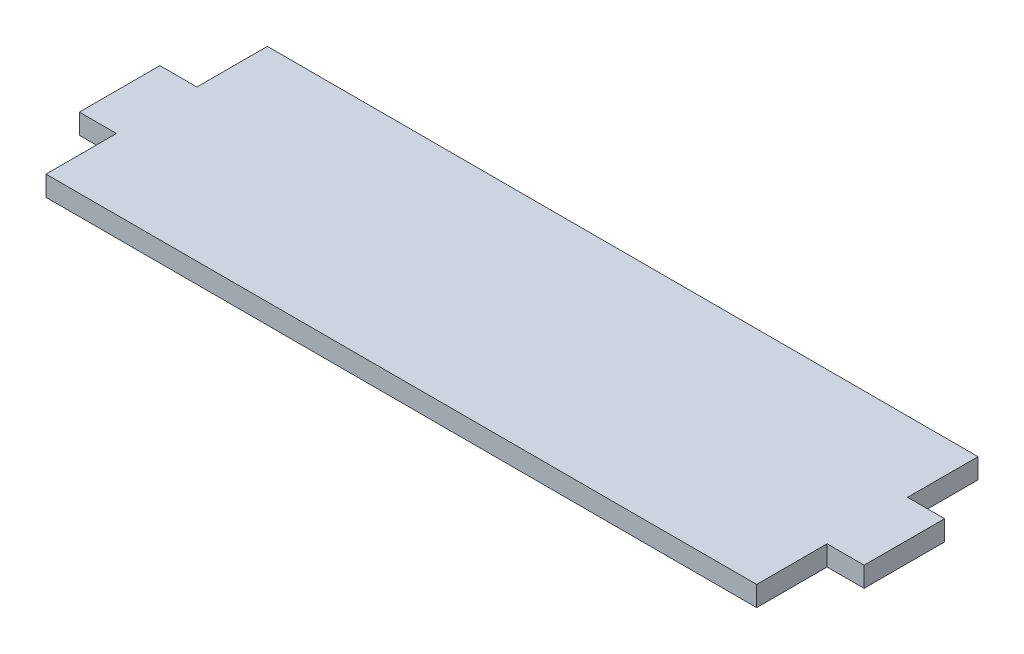
ISO-10303-21;
HEADER;
FILE_DESCRIPTION(('STEP AP214'),'2;1');
FILE_NAME('part.step','',(''),(''),'','','');
FILE_SCHEMA(('AUTOMOTIVE_DESIGN { 1 0 10303 214 1 1 1 1 }'));
ENDSEC;
DATA;
#1=APPLICATION_CONTEXT('core data for automotive mechanical design processes');
#2=APPLICATION_PROTOCOL_DEFINITION('international standard','automotive_design',2000,#1);
#3=PRODUCT_CONTEXT('',#1,'mechanical');
#4=PRODUCT('Part','Part','',(#3));
#5=PRODUCT_RELATED_PRODUCT_CATEGORY('part','',(#4));
#6=PRODUCT_DEFINITION_FORMATION('','',#4);
#7=PRODUCT_DEFINITION_CONTEXT('part definition',#1,'design');
#8=PRODUCT_DEFINITION('design','',#6,#7);
#9=PRODUCT_DEFINITION_SHAPE('','',#8);
#10=(LENGTH_UNIT() NAMED_UNIT(*) SI_UNIT(.MILLI.,.METRE.));
#11=(NAMED_UNIT(*) PLANE_ANGLE_UNIT() SI_UNIT($,.RADIAN.));
#12=(NAMED_UNIT(*) SI_UNIT($,.STERADIAN.) SOLID_ANGLE_UNIT());
#13=UNCERTAINTY_MEASURE_WITH_UNIT(LENGTH_MEASURE(1.E-05),#10,'distance_accuracy_value','');
#14=(GEOMETRIC_REPRESENTATION_CONTEXT(3) GLOBAL_UNCERTAINTY_ASSIGNED_CONTEXT((#13)) GLOBAL_UNIT_ASSIGNED_CONTEXT((#10,
#11,#12)) REPRESENTATION_CONTEXT('',''));
#15=CARTESIAN_POINT('',(0.,0.,0.));
#16=DIRECTION('',(0.,0.,1.));
#17=DIRECTION('',(1.,0.,0.));
#18=AXIS2_PLACEMENT_3D('',#15,#16,#17);
#19=CARTESIAN_POINT('',(-56.0705,3.175,-6.34999999999999));
#20=DIRECTION('',(1.,0.,0.));
#21=DIRECTION('',(0.,0.,-1.));
#22=AXIS2_PLACEMENT_3D('',#19,#20,#21);
#23=PLANE('',#22);
#24=DIRECTION('',(0.,0.,1.));
#25=VECTOR('',#24,1.);
#26=CARTESIAN_POINT('',(-56.0705,0.,-6.34999999999999));
#27=LINE('',#26,#25);
#28=CARTESIAN_POINT('',(-56.0705,0.,-17.4625));
#29=VERTEX_POINT('',#28);
#30=CARTESIAN_POINT('',(-56.0705,0.,-6.34999999999999));
#31=VERTEX_POINT('',#30);
#32=EDGE_CURVE('E155',#29,#31,#27,.T.);
#33=ORIENTED_EDGE('',*,*,#32,.T.);
#34=DIRECTION('',(0.,-1.,0.));
#35=VECTOR('',#34,1.);
#36=CARTESIAN_POINT('',(-56.0705,3.175,-6.34999999999999));
#37=LINE('',#36,#35);
#38=CARTESIAN_POINT('',(-56.0705,3.175,-6.34999999999999));
#39=VERTEX_POINT('',#38);
#40=EDGE_CURVE('E11',#39,#31,#37,.T.);
#41=ORIENTED_EDGE('',*,*,#40,.F.);
#42=DIRECTION('',(0.,0.,1.));
#43=VECTOR('',#42,1.);
#44=CARTESIAN_POINT('',(-56.0705,3.175,-6.34999999999999));
#45=LINE('',#44,#43);
#46=CARTESIAN_POINT('',(-56.0705,3.175,-17.4625));
#47=VERTEX_POINT('',#46);
#48=EDGE_CURVE('E177',#47,#39,#45,.T.);
#49=ORIENTED_EDGE('',*,*,#48,.F.);
#50=DIRECTION('',(0.,-1.,0.));
#51=VECTOR('',#50,1.);
#52=CARTESIAN_POINT('',(-56.0705,3.175,-17.4625));
#53=LINE('',#52,#51);
#54=EDGE_CURVE('E151',#47,#29,#53,.T.);
#55=ORIENTED_EDGE('',*,*,#54,.T.);
#56=EDGE_LOOP('',(#33,#41,#49,#55));
#57=FACE_BOUND('',#56,.T.);
#58=ADVANCED_FACE('F35',(#57),#23,.F.);
#59=CARTESIAN_POINT('',(-61.9125,3.175,-6.34999999999999));
#60=DIRECTION('',(0.,0.,1.));
#61=DIRECTION('',(1.,0.,0.));
#62=AXIS2_PLACEMENT_3D('',#59,#60,#61);
#63=PLANE('',#62);
#64=DIRECTION('',(-1.,0.,0.));
#65=VECTOR('',#64,1.);
#66=CARTESIAN_POINT('',(-61.9125,0.,-6.34999999999999));
#67=LINE('',#66,#65);
#68=CARTESIAN_POINT('',(-61.9125,0.,-6.34999999999999));
#69=VERTEX_POINT('',#68);
#70=EDGE_CURVE('E158',#31,#69,#67,.T.);
#71=ORIENTED_EDGE('',*,*,#70,.T.);
#72=DIRECTION('',(0.,-1.,0.));
#73=VECTOR('',#72,1.);
#74=CARTESIAN_POINT('',(-61.9125,3.175,-6.34999999999999));
#75=LINE('',#74,#73);
#76=CARTESIAN_POINT('',(-61.9125,3.175,-6.34999999999999));
#77=VERTEX_POINT('',#76);
#78=EDGE_CURVE('E43',#77,#69,#75,.T.);
#79=ORIENTED_EDGE('',*,*,#78,.F.);
#80=DIRECTION('',(-1.,0.,0.));
#81=VECTOR('',#80,1.);
#82=CARTESIAN_POINT('',(-61.9125,3.175,-6.34999999999999));
#83=LINE('',#82,#81);
#84=EDGE_CURVE('E106',#39,#77,#83,.T.);
#85=ORIENTED_EDGE('',*,*,#84,.F.);
#86=ORIENTED_EDGE('',*,*,#40,.T.);
#87=EDGE_LOOP('',(#71,#79,#85,#86));
#88=FACE_BOUND('',#87,.T.);
#89=ADVANCED_FACE('F255',(#88),#63,.F.);
#90=CARTESIAN_POINT('',(-61.9125,3.175,6.35000000000001));
#91=DIRECTION('',(1.,0.,0.));
#92=DIRECTION('',(0.,0.,-1.));
#93=AXIS2_PLACEMENT_3D('',#90,#91,#92);
#94=PLANE('',#93);
#95=DIRECTION('',(0.,0.,1.));
#96=VECTOR('',#95,1.);
#97=CARTESIAN_POINT('',(-61.9125,0.,6.35000000000001));
#98=LINE('',#97,#96);
#99=CARTESIAN_POINT('',(-61.9125,0.,6.35000000000001));
#100=VERTEX_POINT('',#99);
#101=EDGE_CURVE('E160',#69,#100,#98,.T.);
#102=ORIENTED_EDGE('',*,*,#101,.T.);
#103=DIRECTION('',(0.,-1.,0.));
#104=VECTOR('',#103,1.);
#105=CARTESIAN_POINT('',(-61.9125,3.175,6.35000000000001));
#106=LINE('',#105,#104);
#107=CARTESIAN_POINT('',(-61.9125,3.175,6.35000000000001));
#108=VERTEX_POINT('',#107);
#109=EDGE_CURVE('E196',#108,#100,#106,.T.);
#110=ORIENTED_EDGE('',*,*,#109,.F.);
#111=DIRECTION('',(0.,0.,1.));
#112=VECTOR('',#111,1.);
#113=CARTESIAN_POINT('',(-61.9125,3.175,6.35000000000001));
#114=LINE('',#113,#112);
#115=EDGE_CURVE('E204',#77,#108,#114,.T.);
#116=ORIENTED_EDGE('',*,*,#115,.F.);
#117=ORIENTED_EDGE('',*,*,#78,.T.);
#118=EDGE_LOOP('',(#102,#110,#116,#117));
#119=FACE_BOUND('',#118,.T.);
#120=ADVANCED_FACE('F202',(#119),#94,.F.);
#121=CARTESIAN_POINT('',(-61.9125,3.175,6.35000000000001));
#122=DIRECTION('',(0.,0.,-1.));
#123=DIRECTION('',(-1.,0.,0.));
#124=AXIS2_PLACEMENT_3D('',#121,#122,#123);
#125=PLANE('',#124);
#126=DIRECTION('',(1.,0.,0.));
#127=VECTOR('',#126,1.);
#128=CARTESIAN_POINT('',(-61.9125,0.,6.35000000000001));
#129=LINE('',#128,#127);
#130=CARTESIAN_POINT('',(-56.0705,0.,6.35000000000001));
#131=VERTEX_POINT('',#130);
#132=EDGE_CURVE('E162',#100,#131,#129,.T.);
#133=ORIENTED_EDGE('',*,*,#132,.T.);
#134=DIRECTION('',(0.,-1.,0.));
#135=VECTOR('',#134,1.);
#136=CARTESIAN_POINT('',(-56.0705,3.175,6.35000000000001));
#137=LINE('',#136,#135);
#138=CARTESIAN_POINT('',(-56.0705,3.175,6.35000000000001));
#139=VERTEX_POINT('',#138);
#140=EDGE_CURVE('E193',#139,#131,#137,.T.);
#141=ORIENTED_EDGE('',*,*,#140,.F.);
#142=DIRECTION('',(1.,0.,0.));
#143=VECTOR('',#142,1.);
#144=CARTESIAN_POINT('',(-61.9125,3.175,6.35000000000001));
#145=LINE('',#144,#143);
#146=EDGE_CURVE('E222',#108,#139,#145,.T.);
#147=ORIENTED_EDGE('',*,*,#146,.F.);
#148=ORIENTED_EDGE('',*,*,#109,.T.);
#149=EDGE_LOOP('',(#133,#141,#147,#148));
#150=FACE_BOUND('',#149,.T.);
#151=ADVANCED_FACE('F213',(#150),#125,.F.);
#152=CARTESIAN_POINT('',(-56.0705,3.175,17.4625));
#153=DIRECTION('',(1.,0.,0.));
#154=DIRECTION('',(0.,0.,-1.));
#155=AXIS2_PLACEMENT_3D('',#152,#153,#154);
#156=PLANE('',#155);
#157=DIRECTION('',(0.,0.,1.));
#158=VECTOR('',#157,1.);
#159=CARTESIAN_POINT('',(-56.0705,0.,17.4625));
#160=LINE('',#159,#158);
#161=CARTESIAN_POINT('',(-56.0705,0.,17.4625));
#162=VERTEX_POINT('',#161);
#163=EDGE_CURVE('E164',#131,#162,#160,.T.);
#164=ORIENTED_EDGE('',*,*,#163,.T.);
#165=DIRECTION('',(0.,-1.,0.));
#166=VECTOR('',#165,1.);
#167=CARTESIAN_POINT('',(-56.0705,3.175,17.4625));
#168=LINE('',#167,#166);
#169=CARTESIAN_POINT('',(-56.0705,3.175,17.4625));
#170=VERTEX_POINT('',#169);
#171=EDGE_CURVE('E190',#170,#162,#168,.T.);
#172=ORIENTED_EDGE('',*,*,#171,.F.);
#173=DIRECTION('',(0.,0.,1.));
#174=VECTOR('',#173,1.);
#175=CARTESIAN_POINT('',(-56.0705,3.175,17.4625));
#176=LINE('',#175,#174);
#177=EDGE_CURVE('E219',#139,#170,#176,.T.);
#178=ORIENTED_EDGE('',*,*,#177,.F.);
#179=ORIENTED_EDGE('',*,*,#140,.T.);
#180=EDGE_LOOP('',(#164,#172,#178,#179));
#181=FACE_BOUND('',#180,.T.);
#182=ADVANCED_FACE('F217',(#181),#156,.F.);
#183=CARTESIAN_POINT('',(56.0705,3.175,17.4625));
#184=DIRECTION('',(0.,0.,-1.));
#185=DIRECTION('',(-1.,0.,0.));
#186=AXIS2_PLACEMENT_3D('',#183,#184,#185);
#187=PLANE('',#186);
#188=DIRECTION('',(1.,0.,0.));
#189=VECTOR('',#188,1.);
#190=CARTESIAN_POINT('',(56.0705,0.,17.4625));
#191=LINE('',#190,#189);
#192=CARTESIAN_POINT('',(56.0705,0.,17.4625));
#193=VERTEX_POINT('',#192);
#194=EDGE_CURVE('E166',#162,#193,#191,.T.);
#195=ORIENTED_EDGE('',*,*,#194,.T.);
#196=DIRECTION('',(0.,-1.,0.));
#197=VECTOR('',#196,1.);
#198=CARTESIAN_POINT('',(56.0705,3.175,17.4625));
#199=LINE('',#198,#197);
#200=CARTESIAN_POINT('',(56.0705,3.175,17.4625));
#201=VERTEX_POINT('',#200);
#202=EDGE_CURVE('E187',#201,#193,#199,.T.);
#203=ORIENTED_EDGE('',*,*,#202,.F.);
#204=DIRECTION('',(1.,0.,0.));
#205=VECTOR('',#204,1.);
#206=CARTESIAN_POINT('',(56.0705,3.175,17.4625));
#207=LINE('',#206,#205);
#208=EDGE_CURVE('E221',#170,#201,#207,.T.);
#209=ORIENTED_EDGE('',*,*,#208,.F.);
#210=ORIENTED_EDGE('',*,*,#171,.T.);
#211=EDGE_LOOP('',(#195,#203,#209,#210));
#212=FACE_BOUND('',#211,.T.);
#213=ADVANCED_FACE('F268',(#212),#187,.F.);
#214=CARTESIAN_POINT('',(56.0705,3.175,17.4625));
#215=DIRECTION('',(-1.,0.,0.));
#216=DIRECTION('',(0.,0.,1.));
#217=AXIS2_PLACEMENT_3D('',#214,#215,#216);
#218=PLANE('',#217);
#219=DIRECTION('',(0.,0.,-1.));
#220=VECTOR('',#219,1.);
#221=CARTESIAN_POINT('',(56.0705,0.,17.4625));
#222=LINE('',#221,#220);
#223=CARTESIAN_POINT('',(56.0705,0.,6.35));
#224=VERTEX_POINT('',#223);
#225=EDGE_CURVE('E168',#193,#224,#222,.T.);
#226=ORIENTED_EDGE('',*,*,#225,.T.);
#227=DIRECTION('',(0.,-1.,0.));
#228=VECTOR('',#227,1.);
#229=CARTESIAN_POINT('',(56.0705,3.175,6.35));
#230=LINE('',#229,#228);
#231=CARTESIAN_POINT('',(56.0705,3.175,6.35));
#232=VERTEX_POINT('',#231);
#233=EDGE_CURVE('E184',#232,#224,#230,.T.);
#234=ORIENTED_EDGE('',*,*,#233,.F.);
#235=DIRECTION('',(0.,0.,-1.));
#236=VECTOR('',#235,1.);
#237=CARTESIAN_POINT('',(56.0705,3.175,17.4625));
#238=LINE('',#237,#236);
#239=EDGE_CURVE('E224',#201,#232,#238,.T.);
#240=ORIENTED_EDGE('',*,*,#239,.F.);
#241=ORIENTED_EDGE('',*,*,#202,.T.);
#242=EDGE_LOOP('',(#226,#234,#240,#241));
#243=FACE_BOUND('',#242,.T.);
#244=ADVANCED_FACE('F271',(#243),#218,.F.);
#245=CARTESIAN_POINT('',(61.9125,3.175,6.35));
#246=DIRECTION('',(0.,0.,-1.));
#247=DIRECTION('',(-1.,0.,0.));
#248=AXIS2_PLACEMENT_3D('',#245,#246,#247);
#249=PLANE('',#248);
#250=DIRECTION('',(1.,0.,0.));
#251=VECTOR('',#250,1.);
#252=CARTESIAN_POINT('',(61.9125,0.,6.35));
#253=LINE('',#252,#251);
#254=CARTESIAN_POINT('',(61.9125,0.,6.35));
#255=VERTEX_POINT('',#254);
#256=EDGE_CURVE('E170',#224,#255,#253,.T.);
#257=ORIENTED_EDGE('',*,*,#256,.T.);
#258=DIRECTION('',(0.,-1.,0.));
#259=VECTOR('',#258,1.);
#260=CARTESIAN_POINT('',(61.9125,3.175,6.35));
#261=LINE('',#260,#259);
#262=CARTESIAN_POINT('',(61.9125,3.175,6.35));
#263=VERTEX_POINT('',#262);
#264=EDGE_CURVE('E181',#263,#255,#261,.T.);
#265=ORIENTED_EDGE('',*,*,#264,.F.);
#266=DIRECTION('',(1.,0.,0.));
#267=VECTOR('',#266,1.);
#268=CARTESIAN_POINT('',(61.9125,3.175,6.35));
#269=LINE('',#268,#267);
#270=EDGE_CURVE('E230',#232,#263,#269,.T.);
#271=ORIENTED_EDGE('',*,*,#270,.F.);
#272=ORIENTED_EDGE('',*,*,#233,.T.);
#273=EDGE_LOOP('',(#257,#265,#271,#272));
#274=FACE_BOUND('',#273,.T.);
#275=ADVANCED_FACE('F236',(#274),#249,.F.);
#276=CARTESIAN_POINT('',(61.9125,3.175,6.35));
#277=DIRECTION('',(-1.,0.,0.));
#278=DIRECTION('',(0.,0.,1.));
#279=AXIS2_PLACEMENT_3D('',#276,#277,#278);
#280=PLANE('',#279);
#281=DIRECTION('',(0.,0.,-1.));
#282=VECTOR('',#281,1.);
#283=CARTESIAN_POINT('',(61.9125,0.,6.35));
#284=LINE('',#283,#282);
#285=CARTESIAN_POINT('',(61.9125,0.,-6.35));
#286=VERTEX_POINT('',#285);
#287=EDGE_CURVE('E172',#255,#286,#284,.T.);
#288=ORIENTED_EDGE('',*,*,#287,.T.);
#289=DIRECTION('',(0.,-1.,0.));
#290=VECTOR('',#289,1.);
#291=CARTESIAN_POINT('',(61.9125,3.175,-6.35));
#292=LINE('',#291,#290);
#293=CARTESIAN_POINT('',(61.9125,3.175,-6.35));
#294=VERTEX_POINT('',#293);
#295=EDGE_CURVE('E146',#294,#286,#292,.T.);
#296=ORIENTED_EDGE('',*,*,#295,.F.);
#297=DIRECTION('',(0.,0.,-1.));
#298=VECTOR('',#297,1.);
#299=CARTESIAN_POINT('',(61.9125,3.175,6.35));
#300=LINE('',#299,#298);
#301=EDGE_CURVE('E137',#263,#294,#300,.T.);
#302=ORIENTED_EDGE('',*,*,#301,.F.);
#303=ORIENTED_EDGE('',*,*,#264,.T.);
#304=EDGE_LOOP('',(#288,#296,#302,#303));
#305=FACE_BOUND('',#304,.T.);
#306=ADVANCED_FACE('F240',(#305),#280,.F.);
#307=CARTESIAN_POINT('',(61.9125,3.175,-6.35));
#308=DIRECTION('',(0.,0.,1.));
#309=DIRECTION('',(1.,0.,0.));
#310=AXIS2_PLACEMENT_3D('',#307,#308,#309);
#311=PLANE('',#310);
#312=DIRECTION('',(-1.,0.,0.));
#313=VECTOR('',#312,1.);
#314=CARTESIAN_POINT('',(61.9125,0.,-6.35));
#315=LINE('',#314,#313);
#316=CARTESIAN_POINT('',(56.0705,0.,-6.35));
#317=VERTEX_POINT('',#316);
#318=EDGE_CURVE('E145',#286,#317,#315,.T.);
#319=ORIENTED_EDGE('',*,*,#318,.T.);
#320=DIRECTION('',(0.,-1.,0.));
#321=VECTOR('',#320,1.);
#322=CARTESIAN_POINT('',(56.0705,3.175,-6.35));
#323=LINE('',#322,#321);
#324=CARTESIAN_POINT('',(56.0705,3.175,-6.35));
#325=VERTEX_POINT('',#324);
#326=EDGE_CURVE('E142',#325,#317,#323,.T.);
#327=ORIENTED_EDGE('',*,*,#326,.F.);
#328=DIRECTION('',(-1.,0.,0.));
#329=VECTOR('',#328,1.);
#330=CARTESIAN_POINT('',(61.9125,3.175,-6.35));
#331=LINE('',#330,#329);
#332=EDGE_CURVE('E131',#294,#325,#331,.T.);
#333=ORIENTED_EDGE('',*,*,#332,.F.);
#334=ORIENTED_EDGE('',*,*,#295,.T.);
#335=EDGE_LOOP('',(#319,#327,#333,#334));
#336=FACE_BOUND('',#335,.T.);
#337=ADVANCED_FACE('F143',(#336),#311,.F.);
#338=CARTESIAN_POINT('',(56.0705,3.175,-6.35));
#339=DIRECTION('',(-1.,0.,0.));
#340=DIRECTION('',(0.,0.,1.));
#341=AXIS2_PLACEMENT_3D('',#338,#339,#340);
#342=PLANE('',#341);
#343=DIRECTION('',(0.,0.,-1.));
#344=VECTOR('',#343,1.);
#345=CARTESIAN_POINT('',(56.0705,0.,-6.35));
#346=LINE('',#345,#344);
#347=CARTESIAN_POINT('',(56.0705,0.,-17.4625));
#348=VERTEX_POINT('',#347);
#349=EDGE_CURVE('E92',#317,#348,#346,.T.);
#350=ORIENTED_EDGE('',*,*,#349,.T.);
#351=DIRECTION('',(0.,-1.,0.));
#352=VECTOR('',#351,1.);
#353=CARTESIAN_POINT('',(56.0705,3.175,-17.4625));
#354=LINE('',#353,#352);
#355=CARTESIAN_POINT('',(56.0705,3.175,-17.4625));
#356=VERTEX_POINT('',#355);
#357=EDGE_CURVE('E147',#356,#348,#354,.T.);
#358=ORIENTED_EDGE('',*,*,#357,.F.);
#359=DIRECTION('',(0.,0.,-1.));
#360=VECTOR('',#359,1.);
#361=CARTESIAN_POINT('',(56.0705,3.175,-6.35));
#362=LINE('',#361,#360);
#363=EDGE_CURVE('E135',#325,#356,#362,.T.);
#364=ORIENTED_EDGE('',*,*,#363,.F.);
#365=ORIENTED_EDGE('',*,*,#326,.T.);
#366=EDGE_LOOP('',(#350,#358,#364,#365));
#367=FACE_BOUND('',#366,.T.);
#368=ADVANCED_FACE('F149',(#367),#342,.F.);
#369=CARTESIAN_POINT('',(56.0705,3.175,-17.4625));
#370=DIRECTION('',(0.,0.,1.));
#371=DIRECTION('',(1.,0.,0.));
#372=AXIS2_PLACEMENT_3D('',#369,#370,#371);
#373=PLANE('',#372);
#374=DIRECTION('',(-1.,0.,0.));
#375=VECTOR('',#374,1.);
#376=CARTESIAN_POINT('',(56.0705,0.,-17.4625));
#377=LINE('',#376,#375);
#378=EDGE_CURVE('E98',#348,#29,#377,.T.);
#379=ORIENTED_EDGE('',*,*,#378,.T.);
#380=ORIENTED_EDGE('',*,*,#54,.F.);
#381=DIRECTION('',(-1.,0.,0.));
#382=VECTOR('',#381,1.);
#383=CARTESIAN_POINT('',(56.0705,3.175,-17.4625));
#384=LINE('',#383,#382);
#385=EDGE_CURVE('E51',#356,#47,#384,.T.);
#386=ORIENTED_EDGE('',*,*,#385,.F.);
#387=ORIENTED_EDGE('',*,*,#357,.T.);
#388=EDGE_LOOP('',(#379,#380,#386,#387));
#389=FACE_BOUND('',#388,.T.);
#390=ADVANCED_FACE('F244',(#389),#373,.F.);
#391=CARTESIAN_POINT('',(0.,3.175,0.));
#392=DIRECTION('',(0.,1.,0.));
#393=DIRECTION('',(0.,0.,1.));
#394=AXIS2_PLACEMENT_3D('',#391,#392,#393);
#395=PLANE('',#394);
#396=ORIENTED_EDGE('',*,*,#48,.T.);
#397=ORIENTED_EDGE('',*,*,#84,.T.);
#398=ORIENTED_EDGE('',*,*,#115,.T.);
#399=ORIENTED_EDGE('',*,*,#146,.T.);
#400=ORIENTED_EDGE('',*,*,#177,.T.);
#401=ORIENTED_EDGE('',*,*,#208,.T.);
#402=ORIENTED_EDGE('',*,*,#239,.T.);
#403=ORIENTED_EDGE('',*,*,#270,.T.);
#404=ORIENTED_EDGE('',*,*,#301,.T.);
#405=ORIENTED_EDGE('',*,*,#332,.T.);
#406=ORIENTED_EDGE('',*,*,#363,.T.);
#407=ORIENTED_EDGE('',*,*,#385,.T.);
#408=EDGE_LOOP('',(#396,#397,#398,#399,#400,#401,#402,#403,#404,#405,#406,#407));
#409=FACE_BOUND('',#408,.T.);
#410=ADVANCED_FACE('F133',(#409),#395,.T.);
#411=CARTESIAN_POINT('',(0.,0.,0.));
#412=DIRECTION('',(0.,1.,0.));
#413=DIRECTION('',(0.,0.,1.));
#414=AXIS2_PLACEMENT_3D('',#411,#412,#413);
#415=PLANE('',#414);
#416=ORIENTED_EDGE('',*,*,#32,.F.);
#417=ORIENTED_EDGE('',*,*,#378,.F.);
#418=ORIENTED_EDGE('',*,*,#349,.F.);
#419=ORIENTED_EDGE('',*,*,#318,.F.);
#420=ORIENTED_EDGE('',*,*,#287,.F.);
#421=ORIENTED_EDGE('',*,*,#256,.F.);
#422=ORIENTED_EDGE('',*,*,#225,.F.);
#423=ORIENTED_EDGE('',*,*,#194,.F.);
#424=ORIENTED_EDGE('',*,*,#163,.F.);
#425=ORIENTED_EDGE('',*,*,#132,.F.);
#426=ORIENTED_EDGE('',*,*,#101,.F.);
#427=ORIENTED_EDGE('',*,*,#70,.F.);
#428=EDGE_LOOP('',(#416,#417,#418,#419,#420,#421,#422,#423,#424,#425,#426,#427));
#429=FACE_BOUND('',#428,.T.);
#430=ADVANCED_FACE('F208',(#429),#415,.F.);
#431=CLOSED_SHELL('',(#58,#89,#120,#151,#182,#213,#244,#275,#306,#337,#368,#390,#410,#430));
#432=MANIFOLD_SOLID_BREP('B2',#431);
#433=ADVANCED_BREP_SHAPE_REPRESENTATION('',(#18,#432),#14);
#434=SHAPE_DEFINITION_REPRESENTATION(#9,#433);
ENDSEC;
END-ISO-10303-21;
